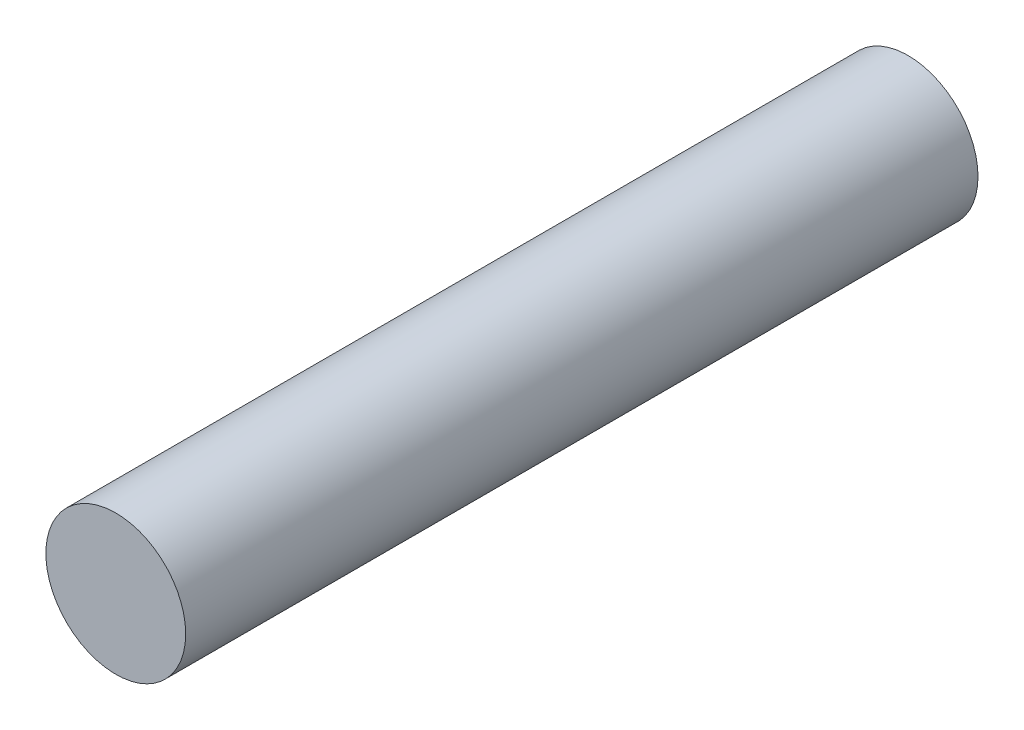
ISO-10303-21;
HEADER;
FILE_DESCRIPTION(('STEP AP214'),'2;1');
FILE_NAME('part.step','',(''),(''),'','','');
FILE_SCHEMA(('AUTOMOTIVE_DESIGN { 1 0 10303 214 1 1 1 1 }'));
ENDSEC;
DATA;
#1=APPLICATION_CONTEXT('core data for automotive mechanical design processes');
#2=APPLICATION_PROTOCOL_DEFINITION('international standard','automotive_design',2000,#1);
#3=PRODUCT_CONTEXT('',#1,'mechanical');
#4=PRODUCT('Part','Part','',(#3));
#5=PRODUCT_RELATED_PRODUCT_CATEGORY('part','',(#4));
#6=PRODUCT_DEFINITION_FORMATION('','',#4);
#7=PRODUCT_DEFINITION_CONTEXT('part definition',#1,'design');
#8=PRODUCT_DEFINITION('design','',#6,#7);
#9=PRODUCT_DEFINITION_SHAPE('','',#8);
#10=(LENGTH_UNIT() NAMED_UNIT(*) SI_UNIT(.MILLI.,.METRE.));
#11=(NAMED_UNIT(*) PLANE_ANGLE_UNIT() SI_UNIT($,.RADIAN.));
#12=(NAMED_UNIT(*) SI_UNIT($,.STERADIAN.) SOLID_ANGLE_UNIT());
#13=UNCERTAINTY_MEASURE_WITH_UNIT(LENGTH_MEASURE(1.E-05),#10,'distance_accuracy_value','');
#14=(GEOMETRIC_REPRESENTATION_CONTEXT(3) GLOBAL_UNCERTAINTY_ASSIGNED_CONTEXT((#13)) GLOBAL_UNIT_ASSIGNED_CONTEXT((#10,
#11,#12)) REPRESENTATION_CONTEXT('',''));
#15=CARTESIAN_POINT('',(0.,0.,0.));
#16=DIRECTION('',(0.,0.,1.));
#17=DIRECTION('',(1.,0.,0.));
#18=AXIS2_PLACEMENT_3D('',#15,#16,#17);
#19=CARTESIAN_POINT('',(0.,0.,17.));
#20=DIRECTION('',(0.,0.,-1.));
#21=DIRECTION('',(-1.,0.,0.));
#22=AXIS2_PLACEMENT_3D('',#19,#20,#21);
#23=CYLINDRICAL_SURFACE('',#22,1.5);
#24=CARTESIAN_POINT('',(0.,0.,17.));
#25=DIRECTION('',(0.,0.,1.));
#26=DIRECTION('',(1.,0.,0.));
#27=AXIS2_PLACEMENT_3D('',#24,#25,#26);
#28=CIRCLE('',#27,1.5);
#29=CARTESIAN_POINT('',(1.5,0.,17.));
#30=VERTEX_POINT('',#29);
#31=EDGE_CURVE('E10',#30,#30,#28,.T.);
#32=ORIENTED_EDGE('',*,*,#31,.F.);
#33=EDGE_LOOP('',(#32));
#34=FACE_BOUND('',#33,.T.);
#35=CARTESIAN_POINT('',(0.,0.,0.));
#36=DIRECTION('',(0.,0.,1.));
#37=DIRECTION('',(1.,0.,0.));
#38=AXIS2_PLACEMENT_3D('',#35,#36,#37);
#39=CIRCLE('',#38,1.5);
#40=CARTESIAN_POINT('',(1.5,0.,0.));
#41=VERTEX_POINT('',#40);
#42=EDGE_CURVE('E40',#41,#41,#39,.T.);
#43=ORIENTED_EDGE('',*,*,#42,.T.);
#44=EDGE_LOOP('',(#43));
#45=FACE_BOUND('',#44,.T.);
#46=ADVANCED_FACE('F37',(#34,#45),#23,.T.);
#47=CARTESIAN_POINT('',(0.,0.,17.));
#48=DIRECTION('',(0.,0.,1.));
#49=DIRECTION('',(1.,0.,0.));
#50=AXIS2_PLACEMENT_3D('',#47,#48,#49);
#51=PLANE('',#50);
#52=ORIENTED_EDGE('',*,*,#31,.T.);
#53=EDGE_LOOP('',(#52));
#54=FACE_BOUND('',#53,.T.);
#55=ADVANCED_FACE('F52',(#54),#51,.T.);
#56=CARTESIAN_POINT('',(0.,0.,0.));
#57=DIRECTION('',(0.,0.,1.));
#58=DIRECTION('',(1.,0.,0.));
#59=AXIS2_PLACEMENT_3D('',#56,#57,#58);
#60=PLANE('',#59);
#61=ORIENTED_EDGE('',*,*,#42,.F.);
#62=EDGE_LOOP('',(#61));
#63=FACE_BOUND('',#62,.T.);
#64=ADVANCED_FACE('F50',(#63),#60,.F.);
#65=CLOSED_SHELL('',(#46,#55,#64));
#66=MANIFOLD_SOLID_BREP('B2',#65);
#67=ADVANCED_BREP_SHAPE_REPRESENTATION('',(#18,#66),#14);
#68=SHAPE_DEFINITION_REPRESENTATION(#9,#67);
ENDSEC;
END-ISO-10303-21;
